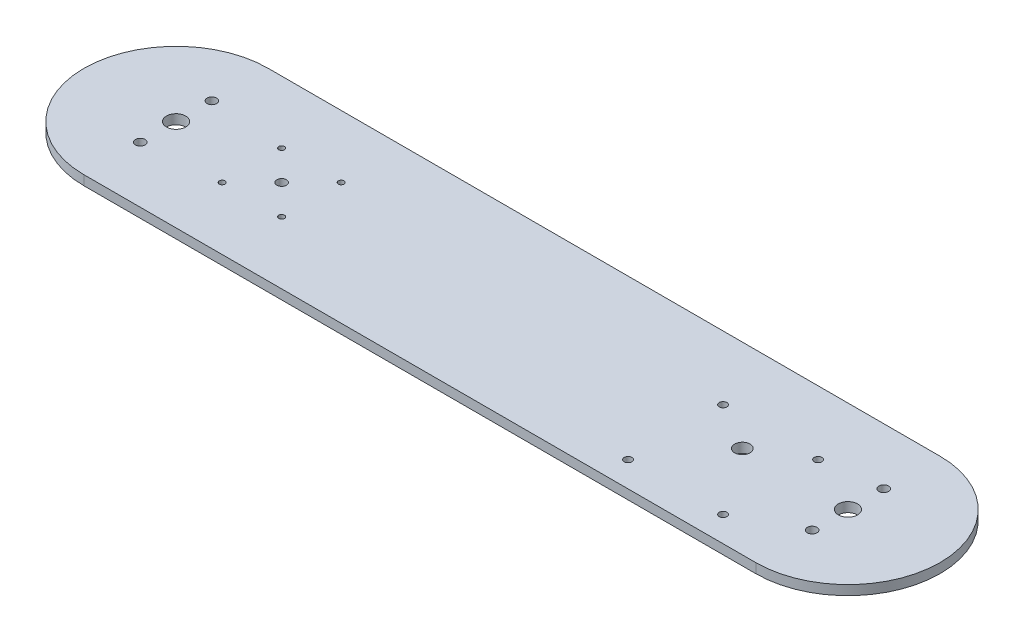
ISO-10303-21;
HEADER;
FILE_DESCRIPTION(('STEP AP214'),'2;1');
FILE_NAME('part.step','',(''),(''),'','','');
FILE_SCHEMA(('AUTOMOTIVE_DESIGN { 1 0 10303 214 1 1 1 1 }'));
ENDSEC;
DATA;
#1=APPLICATION_CONTEXT('core data for automotive mechanical design processes');
#2=APPLICATION_PROTOCOL_DEFINITION('international standard','automotive_design',2000,#1);
#3=PRODUCT_CONTEXT('',#1,'mechanical');
#4=PRODUCT('Part','Part','',(#3));
#5=PRODUCT_RELATED_PRODUCT_CATEGORY('part','',(#4));
#6=PRODUCT_DEFINITION_FORMATION('','',#4);
#7=PRODUCT_DEFINITION_CONTEXT('part definition',#1,'design');
#8=PRODUCT_DEFINITION('design','',#6,#7);
#9=PRODUCT_DEFINITION_SHAPE('','',#8);
#10=(LENGTH_UNIT() NAMED_UNIT(*) SI_UNIT(.MILLI.,.METRE.));
#11=(NAMED_UNIT(*) PLANE_ANGLE_UNIT() SI_UNIT($,.RADIAN.));
#12=(NAMED_UNIT(*) SI_UNIT($,.STERADIAN.) SOLID_ANGLE_UNIT());
#13=UNCERTAINTY_MEASURE_WITH_UNIT(LENGTH_MEASURE(1.E-05),#10,'distance_accuracy_value','');
#14=(GEOMETRIC_REPRESENTATION_CONTEXT(3) GLOBAL_UNCERTAINTY_ASSIGNED_CONTEXT((#13)) GLOBAL_UNIT_ASSIGNED_CONTEXT((#10,
#11,#12)) REPRESENTATION_CONTEXT('',''));
#15=CARTESIAN_POINT('',(0.,0.,0.));
#16=DIRECTION('',(0.,0.,1.));
#17=DIRECTION('',(1.,0.,0.));
#18=AXIS2_PLACEMENT_3D('',#15,#16,#17);
#19=CARTESIAN_POINT('',(-175.,5.,0.));
#20=DIRECTION('',(0.,1.,0.));
#21=DIRECTION('',(0.,0.,1.));
#22=AXIS2_PLACEMENT_3D('',#19,#20,#21);
#23=PLANE('',#22);
#24=CARTESIAN_POINT('',(95.25,5.,-14.7));
#25=DIRECTION('',(0.,1.,0.));
#26=DIRECTION('',(0.,0.,1.));
#27=AXIS2_PLACEMENT_3D('',#24,#25,#26);
#28=CIRCLE('',#27,2.);
#29=CARTESIAN_POINT('',(95.25,5.,-12.7));
#30=VERTEX_POINT('',#29);
#31=EDGE_CURVE('E106',#30,#30,#28,.T.);
#32=ORIENTED_EDGE('',*,*,#31,.F.);
#33=EDGE_LOOP('',(#32));
#34=FACE_BOUND('',#33,.T.);
#35=CARTESIAN_POINT('',(-175.,5.,-18.65));
#36=DIRECTION('',(0.,1.,0.));
#37=DIRECTION('',(0.,0.,1.));
#38=AXIS2_PLACEMENT_3D('',#35,#36,#37);
#39=CIRCLE('',#38,2.50000000000002);
#40=CARTESIAN_POINT('',(-175.,5.,-16.15));
#41=VERTEX_POINT('',#40);
#42=EDGE_CURVE('E144',#41,#41,#39,.F.);
#43=ORIENTED_EDGE('',*,*,#42,.T.);
#44=EDGE_LOOP('',(#43));
#45=FACE_BOUND('',#44,.T.);
#46=CARTESIAN_POINT('',(-175.,5.,0.));
#47=DIRECTION('',(0.,1.,0.));
#48=DIRECTION('',(0.,0.,1.));
#49=AXIS2_PLACEMENT_3D('',#46,#47,#48);
#50=CIRCLE('',#49,48.);
#51=CARTESIAN_POINT('',(-175.,5.,-48.));
#52=VERTEX_POINT('',#51);
#53=CARTESIAN_POINT('',(-175.,5.,48.));
#54=VERTEX_POINT('',#53);
#55=EDGE_CURVE('E91',#52,#54,#50,.T.);
#56=ORIENTED_EDGE('',*,*,#55,.T.);
#57=DIRECTION('',(1.,0.,0.));
#58=VECTOR('',#57,1.);
#59=CARTESIAN_POINT('',(175.,5.,48.));
#60=LINE('',#59,#58);
#61=CARTESIAN_POINT('',(175.,5.,48.));
#62=VERTEX_POINT('',#61);
#63=EDGE_CURVE('E86',#54,#62,#60,.T.);
#64=ORIENTED_EDGE('',*,*,#63,.T.);
#65=CARTESIAN_POINT('',(175.,5.,0.));
#66=DIRECTION('',(0.,1.,0.));
#67=DIRECTION('',(0.,0.,1.));
#68=AXIS2_PLACEMENT_3D('',#65,#66,#67);
#69=CIRCLE('',#68,48.);
#70=CARTESIAN_POINT('',(175.,5.,-48.));
#71=VERTEX_POINT('',#70);
#72=EDGE_CURVE('E89',#62,#71,#69,.T.);
#73=ORIENTED_EDGE('',*,*,#72,.T.);
#74=DIRECTION('',(-1.,0.,0.));
#75=VECTOR('',#74,1.);
#76=CARTESIAN_POINT('',(-175.,5.,-48.));
#77=LINE('',#76,#75);
#78=EDGE_CURVE('E56',#71,#52,#77,.T.);
#79=ORIENTED_EDGE('',*,*,#78,.T.);
#80=EDGE_LOOP('',(#56,#64,#73,#79));
#81=FACE_BOUND('',#80,.T.);
#82=CARTESIAN_POINT('',(175.,5.,18.65));
#83=DIRECTION('',(0.,1.,0.));
#84=DIRECTION('',(0.,0.,1.));
#85=AXIS2_PLACEMENT_3D('',#82,#83,#84);
#86=CIRCLE('',#85,2.50000000000002);
#87=CARTESIAN_POINT('',(175.,5.,21.15));
#88=VERTEX_POINT('',#87);
#89=EDGE_CURVE('E162',#88,#88,#86,.T.);
#90=ORIENTED_EDGE('',*,*,#89,.F.);
#91=EDGE_LOOP('',(#90));
#92=FACE_BOUND('',#91,.T.);
#93=CARTESIAN_POINT('',(175.,5.,-18.65));
#94=DIRECTION('',(0.,1.,0.));
#95=DIRECTION('',(0.,0.,1.));
#96=AXIS2_PLACEMENT_3D('',#93,#94,#95);
#97=CIRCLE('',#96,2.50000000000002);
#98=CARTESIAN_POINT('',(175.,5.,-16.15));
#99=VERTEX_POINT('',#98);
#100=EDGE_CURVE('E159',#99,#99,#97,.T.);
#101=ORIENTED_EDGE('',*,*,#100,.F.);
#102=EDGE_LOOP('',(#101));
#103=FACE_BOUND('',#102,.T.);
#104=CARTESIAN_POINT('',(-120.,5.,0.));
#105=DIRECTION('',(0.,1.,0.));
#106=DIRECTION('',(0.,0.,1.));
#107=AXIS2_PLACEMENT_3D('',#104,#105,#106);
#108=CIRCLE('',#107,2.5);
#109=CARTESIAN_POINT('',(-120.,5.,2.49999999999997));
#110=VERTEX_POINT('',#109);
#111=EDGE_CURVE('E156',#110,#110,#108,.T.);
#112=ORIENTED_EDGE('',*,*,#111,.F.);
#113=EDGE_LOOP('',(#112));
#114=FACE_BOUND('',#113,.T.);
#115=CARTESIAN_POINT('',(-135.5,5.,-15.5));
#116=DIRECTION('',(0.,1.,0.));
#117=DIRECTION('',(0.,0.,1.));
#118=AXIS2_PLACEMENT_3D('',#115,#116,#117);
#119=CIRCLE('',#118,1.5);
#120=CARTESIAN_POINT('',(-135.5,5.,-14.));
#121=VERTEX_POINT('',#120);
#122=EDGE_CURVE('E153',#121,#121,#119,.T.);
#123=ORIENTED_EDGE('',*,*,#122,.F.);
#124=EDGE_LOOP('',(#123));
#125=FACE_BOUND('',#124,.T.);
#126=CARTESIAN_POINT('',(-104.5,5.,15.5));
#127=DIRECTION('',(0.,1.,0.));
#128=DIRECTION('',(0.,0.,1.));
#129=AXIS2_PLACEMENT_3D('',#126,#127,#128);
#130=CIRCLE('',#129,1.5);
#131=CARTESIAN_POINT('',(-104.5,5.,17.));
#132=VERTEX_POINT('',#131);
#133=EDGE_CURVE('E150',#132,#132,#130,.T.);
#134=ORIENTED_EDGE('',*,*,#133,.F.);
#135=EDGE_LOOP('',(#134));
#136=FACE_BOUND('',#135,.T.);
#137=CARTESIAN_POINT('',(-175.,5.,18.65));
#138=DIRECTION('',(0.,1.,0.));
#139=DIRECTION('',(0.,0.,1.));
#140=AXIS2_PLACEMENT_3D('',#137,#138,#139);
#141=CIRCLE('',#140,2.50000000000002);
#142=CARTESIAN_POINT('',(-175.,5.,21.15));
#143=VERTEX_POINT('',#142);
#144=EDGE_CURVE('E147',#143,#143,#141,.F.);
#145=ORIENTED_EDGE('',*,*,#144,.T.);
#146=EDGE_LOOP('',(#145));
#147=FACE_BOUND('',#146,.T.);
#148=CARTESIAN_POINT('',(144.75,5.,34.8));
#149=DIRECTION('',(0.,1.,0.));
#150=DIRECTION('',(0.,0.,1.));
#151=AXIS2_PLACEMENT_3D('',#148,#149,#150);
#152=CIRCLE('',#151,2.);
#153=CARTESIAN_POINT('',(144.75,5.,36.8));
#154=VERTEX_POINT('',#153);
#155=EDGE_CURVE('E141',#154,#154,#152,.T.);
#156=ORIENTED_EDGE('',*,*,#155,.F.);
#157=EDGE_LOOP('',(#156));
#158=FACE_BOUND('',#157,.T.);
#159=CARTESIAN_POINT('',(144.75,5.,-14.7));
#160=DIRECTION('',(0.,1.,0.));
#161=DIRECTION('',(0.,0.,1.));
#162=AXIS2_PLACEMENT_3D('',#159,#160,#161);
#163=CIRCLE('',#162,2.);
#164=CARTESIAN_POINT('',(144.75,5.,-12.7));
#165=VERTEX_POINT('',#164);
#166=EDGE_CURVE('E138',#165,#165,#163,.T.);
#167=ORIENTED_EDGE('',*,*,#166,.F.);
#168=EDGE_LOOP('',(#167));
#169=FACE_BOUND('',#168,.T.);
#170=CARTESIAN_POINT('',(95.25,5.,34.8));
#171=DIRECTION('',(0.,1.,0.));
#172=DIRECTION('',(0.,0.,1.));
#173=AXIS2_PLACEMENT_3D('',#170,#171,#172);
#174=CIRCLE('',#173,2.);
#175=CARTESIAN_POINT('',(95.25,5.,36.8));
#176=VERTEX_POINT('',#175);
#177=EDGE_CURVE('E135',#176,#176,#174,.T.);
#178=ORIENTED_EDGE('',*,*,#177,.F.);
#179=EDGE_LOOP('',(#178));
#180=FACE_BOUND('',#179,.T.);
#181=CARTESIAN_POINT('',(120.,5.,0.));
#182=DIRECTION('',(0.,1.,0.));
#183=DIRECTION('',(0.,0.,1.));
#184=AXIS2_PLACEMENT_3D('',#181,#182,#183);
#185=CIRCLE('',#184,4.00000000000001);
#186=CARTESIAN_POINT('',(120.,5.,4.));
#187=VERTEX_POINT('',#186);
#188=EDGE_CURVE('E132',#187,#187,#185,.T.);
#189=ORIENTED_EDGE('',*,*,#188,.F.);
#190=EDGE_LOOP('',(#189));
#191=FACE_BOUND('',#190,.T.);
#192=CARTESIAN_POINT('',(175.,5.,0.));
#193=DIRECTION('',(0.,1.,0.));
#194=DIRECTION('',(0.,0.,1.));
#195=AXIS2_PLACEMENT_3D('',#192,#193,#194);
#196=CIRCLE('',#195,4.99999999999999);
#197=CARTESIAN_POINT('',(175.,5.,4.99999999999999));
#198=VERTEX_POINT('',#197);
#199=EDGE_CURVE('E129',#198,#198,#196,.T.);
#200=ORIENTED_EDGE('',*,*,#199,.F.);
#201=EDGE_LOOP('',(#200));
#202=FACE_BOUND('',#201,.T.);
#203=CARTESIAN_POINT('',(-135.5,5.,15.5));
#204=DIRECTION('',(0.,1.,0.));
#205=DIRECTION('',(0.,0.,1.));
#206=AXIS2_PLACEMENT_3D('',#203,#204,#205);
#207=CIRCLE('',#206,1.5);
#208=CARTESIAN_POINT('',(-135.5,5.,17.));
#209=VERTEX_POINT('',#208);
#210=EDGE_CURVE('E126',#209,#209,#207,.T.);
#211=ORIENTED_EDGE('',*,*,#210,.F.);
#212=EDGE_LOOP('',(#211));
#213=FACE_BOUND('',#212,.T.);
#214=CARTESIAN_POINT('',(-104.5,5.,-15.5));
#215=DIRECTION('',(0.,1.,0.));
#216=DIRECTION('',(0.,0.,1.));
#217=AXIS2_PLACEMENT_3D('',#214,#215,#216);
#218=CIRCLE('',#217,1.5);
#219=CARTESIAN_POINT('',(-104.5,5.,-14.));
#220=VERTEX_POINT('',#219);
#221=EDGE_CURVE('E123',#220,#220,#218,.T.);
#222=ORIENTED_EDGE('',*,*,#221,.F.);
#223=EDGE_LOOP('',(#222));
#224=FACE_BOUND('',#223,.T.);
#225=CARTESIAN_POINT('',(-175.,5.,0.));
#226=DIRECTION('',(0.,1.,0.));
#227=DIRECTION('',(0.,0.,1.));
#228=AXIS2_PLACEMENT_3D('',#225,#226,#227);
#229=CIRCLE('',#228,4.99999999999999);
#230=CARTESIAN_POINT('',(-175.,5.,4.99999999999999));
#231=VERTEX_POINT('',#230);
#232=EDGE_CURVE('E120',#231,#231,#229,.F.);
#233=ORIENTED_EDGE('',*,*,#232,.T.);
#234=EDGE_LOOP('',(#233));
#235=FACE_BOUND('',#234,.T.);
#236=ADVANCED_FACE('F39',(#34,#45,#81,#92,#103,#114,#125,#136,#147,#158,#169,#180,#191,#202,
#213,#224,#235),#23,.T.);
#237=CARTESIAN_POINT('',(-175.,0.,0.));
#238=DIRECTION('',(0.,1.,0.));
#239=DIRECTION('',(0.,0.,1.));
#240=AXIS2_PLACEMENT_3D('',#237,#238,#239);
#241=PLANE('',#240);
#242=CARTESIAN_POINT('',(95.25,0.,-14.7));
#243=DIRECTION('',(0.,-1.,0.));
#244=DIRECTION('',(0.,0.,-1.));
#245=AXIS2_PLACEMENT_3D('',#242,#243,#244);
#246=CIRCLE('',#245,2.);
#247=CARTESIAN_POINT('',(95.25,0.,-16.7));
#248=VERTEX_POINT('',#247);
#249=EDGE_CURVE('E178',#248,#248,#246,.T.);
#250=ORIENTED_EDGE('',*,*,#249,.F.);
#251=EDGE_LOOP('',(#250));
#252=FACE_BOUND('',#251,.T.);
#253=CARTESIAN_POINT('',(-104.5,0.,-15.5));
#254=DIRECTION('',(0.,-1.,0.));
#255=DIRECTION('',(0.,0.,-1.));
#256=AXIS2_PLACEMENT_3D('',#253,#254,#255);
#257=CIRCLE('',#256,1.5);
#258=CARTESIAN_POINT('',(-104.5,0.,-17.));
#259=VERTEX_POINT('',#258);
#260=EDGE_CURVE('E184',#259,#259,#257,.T.);
#261=ORIENTED_EDGE('',*,*,#260,.F.);
#262=EDGE_LOOP('',(#261));
#263=FACE_BOUND('',#262,.T.);
#264=CARTESIAN_POINT('',(-135.5,0.,15.5));
#265=DIRECTION('',(0.,-1.,0.));
#266=DIRECTION('',(0.,0.,-1.));
#267=AXIS2_PLACEMENT_3D('',#264,#265,#266);
#268=CIRCLE('',#267,1.5);
#269=CARTESIAN_POINT('',(-135.5,0.,14.));
#270=VERTEX_POINT('',#269);
#271=EDGE_CURVE('E187',#270,#270,#268,.T.);
#272=ORIENTED_EDGE('',*,*,#271,.F.);
#273=EDGE_LOOP('',(#272));
#274=FACE_BOUND('',#273,.T.);
#275=CARTESIAN_POINT('',(175.,0.,0.));
#276=DIRECTION('',(0.,-1.,0.));
#277=DIRECTION('',(0.,0.,-1.));
#278=AXIS2_PLACEMENT_3D('',#275,#276,#277);
#279=CIRCLE('',#278,4.99999999999999);
#280=CARTESIAN_POINT('',(175.,0.,-4.99999999999999));
#281=VERTEX_POINT('',#280);
#282=EDGE_CURVE('E168',#281,#281,#279,.T.);
#283=ORIENTED_EDGE('',*,*,#282,.F.);
#284=EDGE_LOOP('',(#283));
#285=FACE_BOUND('',#284,.T.);
#286=CARTESIAN_POINT('',(120.,0.,0.));
#287=DIRECTION('',(0.,-1.,0.));
#288=DIRECTION('',(0.,0.,-1.));
#289=AXIS2_PLACEMENT_3D('',#286,#287,#288);
#290=CIRCLE('',#289,4.00000000000001);
#291=CARTESIAN_POINT('',(120.,0.,-4.00000000000001));
#292=VERTEX_POINT('',#291);
#293=EDGE_CURVE('E169',#292,#292,#290,.T.);
#294=ORIENTED_EDGE('',*,*,#293,.F.);
#295=EDGE_LOOP('',(#294));
#296=FACE_BOUND('',#295,.T.);
#297=CARTESIAN_POINT('',(95.25,0.,34.8));
#298=DIRECTION('',(0.,-1.,0.));
#299=DIRECTION('',(0.,0.,-1.));
#300=AXIS2_PLACEMENT_3D('',#297,#298,#299);
#301=CIRCLE('',#300,2.);
#302=CARTESIAN_POINT('',(95.25,0.,32.8));
#303=VERTEX_POINT('',#302);
#304=EDGE_CURVE('E172',#303,#303,#301,.T.);
#305=ORIENTED_EDGE('',*,*,#304,.F.);
#306=EDGE_LOOP('',(#305));
#307=FACE_BOUND('',#306,.T.);
#308=CARTESIAN_POINT('',(144.75,0.,-14.7));
#309=DIRECTION('',(0.,-1.,0.));
#310=DIRECTION('',(0.,0.,-1.));
#311=AXIS2_PLACEMENT_3D('',#308,#309,#310);
#312=CIRCLE('',#311,2.);
#313=CARTESIAN_POINT('',(144.75,0.,-16.7));
#314=VERTEX_POINT('',#313);
#315=EDGE_CURVE('E175',#314,#314,#312,.T.);
#316=ORIENTED_EDGE('',*,*,#315,.F.);
#317=EDGE_LOOP('',(#316));
#318=FACE_BOUND('',#317,.T.);
#319=CARTESIAN_POINT('',(144.75,0.,34.8));
#320=DIRECTION('',(0.,-1.,0.));
#321=DIRECTION('',(0.,0.,-1.));
#322=AXIS2_PLACEMENT_3D('',#319,#320,#321);
#323=CIRCLE('',#322,2.);
#324=CARTESIAN_POINT('',(144.75,0.,32.8));
#325=VERTEX_POINT('',#324);
#326=EDGE_CURVE('E202',#325,#325,#323,.T.);
#327=ORIENTED_EDGE('',*,*,#326,.F.);
#328=EDGE_LOOP('',(#327));
#329=FACE_BOUND('',#328,.T.);
#330=CARTESIAN_POINT('',(-104.5,0.,15.5));
#331=DIRECTION('',(0.,-1.,0.));
#332=DIRECTION('',(0.,0.,-1.));
#333=AXIS2_PLACEMENT_3D('',#330,#331,#332);
#334=CIRCLE('',#333,1.5);
#335=CARTESIAN_POINT('',(-104.5,0.,14.));
#336=VERTEX_POINT('',#335);
#337=EDGE_CURVE('E190',#336,#336,#334,.T.);
#338=ORIENTED_EDGE('',*,*,#337,.F.);
#339=EDGE_LOOP('',(#338));
#340=FACE_BOUND('',#339,.T.);
#341=CARTESIAN_POINT('',(-135.5,0.,-15.5));
#342=DIRECTION('',(0.,-1.,0.));
#343=DIRECTION('',(0.,0.,-1.));
#344=AXIS2_PLACEMENT_3D('',#341,#342,#343);
#345=CIRCLE('',#344,1.5);
#346=CARTESIAN_POINT('',(-135.5,0.,-17.));
#347=VERTEX_POINT('',#346);
#348=EDGE_CURVE('E193',#347,#347,#345,.T.);
#349=ORIENTED_EDGE('',*,*,#348,.F.);
#350=EDGE_LOOP('',(#349));
#351=FACE_BOUND('',#350,.T.);
#352=CARTESIAN_POINT('',(-120.,0.,0.));
#353=DIRECTION('',(0.,-1.,0.));
#354=DIRECTION('',(0.,0.,-1.));
#355=AXIS2_PLACEMENT_3D('',#352,#353,#354);
#356=CIRCLE('',#355,2.5);
#357=CARTESIAN_POINT('',(-120.,0.,-2.50000000000002));
#358=VERTEX_POINT('',#357);
#359=EDGE_CURVE('E196',#358,#358,#356,.T.);
#360=ORIENTED_EDGE('',*,*,#359,.F.);
#361=EDGE_LOOP('',(#360));
#362=FACE_BOUND('',#361,.T.);
#363=CARTESIAN_POINT('',(175.,0.,-18.65));
#364=DIRECTION('',(0.,-1.,0.));
#365=DIRECTION('',(0.,0.,-1.));
#366=AXIS2_PLACEMENT_3D('',#363,#364,#365);
#367=CIRCLE('',#366,2.50000000000002);
#368=CARTESIAN_POINT('',(175.,0.,-21.15));
#369=VERTEX_POINT('',#368);
#370=EDGE_CURVE('E199',#369,#369,#367,.T.);
#371=ORIENTED_EDGE('',*,*,#370,.F.);
#372=EDGE_LOOP('',(#371));
#373=FACE_BOUND('',#372,.T.);
#374=CARTESIAN_POINT('',(175.,0.,18.65));
#375=DIRECTION('',(0.,-1.,0.));
#376=DIRECTION('',(0.,0.,-1.));
#377=AXIS2_PLACEMENT_3D('',#374,#375,#376);
#378=CIRCLE('',#377,2.50000000000002);
#379=CARTESIAN_POINT('',(175.,0.,16.15));
#380=VERTEX_POINT('',#379);
#381=EDGE_CURVE('E165',#380,#380,#378,.T.);
#382=ORIENTED_EDGE('',*,*,#381,.F.);
#383=EDGE_LOOP('',(#382));
#384=FACE_BOUND('',#383,.T.);
#385=CARTESIAN_POINT('',(-175.,0.,0.));
#386=DIRECTION('',(0.,1.,0.));
#387=DIRECTION('',(0.,0.,1.));
#388=AXIS2_PLACEMENT_3D('',#385,#386,#387);
#389=CIRCLE('',#388,48.);
#390=CARTESIAN_POINT('',(-175.,0.,-48.));
#391=VERTEX_POINT('',#390);
#392=CARTESIAN_POINT('',(-175.,0.,48.));
#393=VERTEX_POINT('',#392);
#394=EDGE_CURVE('E103',#391,#393,#389,.T.);
#395=ORIENTED_EDGE('',*,*,#394,.F.);
#396=DIRECTION('',(-1.,0.,0.));
#397=VECTOR('',#396,1.);
#398=CARTESIAN_POINT('',(-175.,0.,-48.));
#399=LINE('',#398,#397);
#400=CARTESIAN_POINT('',(175.,0.,-48.));
#401=VERTEX_POINT('',#400);
#402=EDGE_CURVE('E79',#401,#391,#399,.T.);
#403=ORIENTED_EDGE('',*,*,#402,.F.);
#404=CARTESIAN_POINT('',(175.,0.,0.));
#405=DIRECTION('',(0.,1.,0.));
#406=DIRECTION('',(0.,0.,1.));
#407=AXIS2_PLACEMENT_3D('',#404,#405,#406);
#408=CIRCLE('',#407,48.);
#409=CARTESIAN_POINT('',(175.,0.,48.));
#410=VERTEX_POINT('',#409);
#411=EDGE_CURVE('E73',#410,#401,#408,.T.);
#412=ORIENTED_EDGE('',*,*,#411,.F.);
#413=DIRECTION('',(1.,0.,0.));
#414=VECTOR('',#413,1.);
#415=CARTESIAN_POINT('',(175.,0.,48.));
#416=LINE('',#415,#414);
#417=EDGE_CURVE('E95',#393,#410,#416,.T.);
#418=ORIENTED_EDGE('',*,*,#417,.F.);
#419=EDGE_LOOP('',(#395,#403,#412,#418));
#420=FACE_BOUND('',#419,.T.);
#421=CARTESIAN_POINT('',(-175.,0.,18.65));
#422=DIRECTION('',(0.,1.,0.));
#423=DIRECTION('',(0.,0.,1.));
#424=AXIS2_PLACEMENT_3D('',#421,#422,#423);
#425=CIRCLE('',#424,2.50000000000002);
#426=CARTESIAN_POINT('',(-175.,0.,21.15));
#427=VERTEX_POINT('',#426);
#428=EDGE_CURVE('E208',#427,#427,#425,.T.);
#429=ORIENTED_EDGE('',*,*,#428,.T.);
#430=EDGE_LOOP('',(#429));
#431=FACE_BOUND('',#430,.T.);
#432=CARTESIAN_POINT('',(-175.,0.,-18.65));
#433=DIRECTION('',(0.,1.,0.));
#434=DIRECTION('',(0.,0.,1.));
#435=AXIS2_PLACEMENT_3D('',#432,#433,#434);
#436=CIRCLE('',#435,2.50000000000002);
#437=CARTESIAN_POINT('',(-175.,0.,-16.15));
#438=VERTEX_POINT('',#437);
#439=EDGE_CURVE('E205',#438,#438,#436,.T.);
#440=ORIENTED_EDGE('',*,*,#439,.T.);
#441=EDGE_LOOP('',(#440));
#442=FACE_BOUND('',#441,.T.);
#443=CARTESIAN_POINT('',(-175.,0.,0.));
#444=DIRECTION('',(0.,-1.,0.));
#445=DIRECTION('',(0.,0.,-1.));
#446=AXIS2_PLACEMENT_3D('',#443,#444,#445);
#447=CIRCLE('',#446,4.99999999999999);
#448=CARTESIAN_POINT('',(-175.,0.,-4.99999999999999));
#449=VERTEX_POINT('',#448);
#450=EDGE_CURVE('E181',#449,#449,#447,.F.);
#451=ORIENTED_EDGE('',*,*,#450,.T.);
#452=EDGE_LOOP('',(#451));
#453=FACE_BOUND('',#452,.T.);
#454=ADVANCED_FACE('F114',(#252,#263,#274,#285,#296,#307,#318,#329,#340,#351,#362,#373,#384,
#420,#431,#442,#453),#241,.F.);
#455=CARTESIAN_POINT('',(-175.,5.,0.));
#456=DIRECTION('',(0.,-1.,0.));
#457=DIRECTION('',(0.,0.,-1.));
#458=AXIS2_PLACEMENT_3D('',#455,#456,#457);
#459=CYLINDRICAL_SURFACE('',#458,48.);
#460=ORIENTED_EDGE('',*,*,#394,.T.);
#461=DIRECTION('',(0.,-1.,0.));
#462=VECTOR('',#461,1.);
#463=CARTESIAN_POINT('',(-175.,5.,48.));
#464=LINE('',#463,#462);
#465=EDGE_CURVE('E11',#54,#393,#464,.T.);
#466=ORIENTED_EDGE('',*,*,#465,.F.);
#467=ORIENTED_EDGE('',*,*,#55,.F.);
#468=DIRECTION('',(0.,-1.,0.));
#469=VECTOR('',#468,1.);
#470=CARTESIAN_POINT('',(-175.,5.,-48.));
#471=LINE('',#470,#469);
#472=EDGE_CURVE('E99',#52,#391,#471,.T.);
#473=ORIENTED_EDGE('',*,*,#472,.T.);
#474=EDGE_LOOP('',(#460,#466,#467,#473));
#475=FACE_BOUND('',#474,.T.);
#476=ADVANCED_FACE('F41',(#475),#459,.T.);
#477=CARTESIAN_POINT('',(175.,5.,48.));
#478=DIRECTION('',(0.,0.,-1.));
#479=DIRECTION('',(-1.,0.,0.));
#480=AXIS2_PLACEMENT_3D('',#477,#478,#479);
#481=PLANE('',#480);
#482=ORIENTED_EDGE('',*,*,#417,.T.);
#483=DIRECTION('',(0.,-1.,0.));
#484=VECTOR('',#483,1.);
#485=CARTESIAN_POINT('',(175.,5.,48.));
#486=LINE('',#485,#484);
#487=EDGE_CURVE('E48',#62,#410,#486,.T.);
#488=ORIENTED_EDGE('',*,*,#487,.F.);
#489=ORIENTED_EDGE('',*,*,#63,.F.);
#490=ORIENTED_EDGE('',*,*,#465,.T.);
#491=EDGE_LOOP('',(#482,#488,#489,#490));
#492=FACE_BOUND('',#491,.T.);
#493=ADVANCED_FACE('F94',(#492),#481,.F.);
#494=CARTESIAN_POINT('',(175.,5.,0.));
#495=DIRECTION('',(0.,-1.,0.));
#496=DIRECTION('',(0.,0.,-1.));
#497=AXIS2_PLACEMENT_3D('',#494,#495,#496);
#498=CYLINDRICAL_SURFACE('',#497,48.);
#499=ORIENTED_EDGE('',*,*,#411,.T.);
#500=DIRECTION('',(0.,-1.,0.));
#501=VECTOR('',#500,1.);
#502=CARTESIAN_POINT('',(175.,5.,-48.));
#503=LINE('',#502,#501);
#504=EDGE_CURVE('E96',#71,#401,#503,.T.);
#505=ORIENTED_EDGE('',*,*,#504,.F.);
#506=ORIENTED_EDGE('',*,*,#72,.F.);
#507=ORIENTED_EDGE('',*,*,#487,.T.);
#508=EDGE_LOOP('',(#499,#505,#506,#507));
#509=FACE_BOUND('',#508,.T.);
#510=ADVANCED_FACE('F97',(#509),#498,.T.);
#511=CARTESIAN_POINT('',(-175.,5.,-48.));
#512=DIRECTION('',(0.,0.,1.));
#513=DIRECTION('',(1.,0.,0.));
#514=AXIS2_PLACEMENT_3D('',#511,#512,#513);
#515=PLANE('',#514);
#516=ORIENTED_EDGE('',*,*,#402,.T.);
#517=ORIENTED_EDGE('',*,*,#472,.F.);
#518=ORIENTED_EDGE('',*,*,#78,.F.);
#519=ORIENTED_EDGE('',*,*,#504,.T.);
#520=EDGE_LOOP('',(#516,#517,#518,#519));
#521=FACE_BOUND('',#520,.T.);
#522=ADVANCED_FACE('F111',(#521),#515,.F.);
#523=CARTESIAN_POINT('',(175.,10.,18.65));
#524=DIRECTION('',(0.,-1.,0.));
#525=DIRECTION('',(0.,0.,-1.));
#526=AXIS2_PLACEMENT_3D('',#523,#524,#525);
#527=CYLINDRICAL_SURFACE('',#526,2.50000000000002);
#528=ORIENTED_EDGE('',*,*,#89,.T.);
#529=EDGE_LOOP('',(#528));
#530=FACE_BOUND('',#529,.T.);
#531=ORIENTED_EDGE('',*,*,#381,.T.);
#532=EDGE_LOOP('',(#531));
#533=FACE_BOUND('',#532,.T.);
#534=ADVANCED_FACE('F244',(#530,#533),#527,.F.);
#535=CARTESIAN_POINT('',(175.,10.,-18.65));
#536=DIRECTION('',(0.,-1.,0.));
#537=DIRECTION('',(0.,0.,-1.));
#538=AXIS2_PLACEMENT_3D('',#535,#536,#537);
#539=CYLINDRICAL_SURFACE('',#538,2.50000000000002);
#540=ORIENTED_EDGE('',*,*,#100,.T.);
#541=EDGE_LOOP('',(#540));
#542=FACE_BOUND('',#541,.T.);
#543=ORIENTED_EDGE('',*,*,#370,.T.);
#544=EDGE_LOOP('',(#543));
#545=FACE_BOUND('',#544,.T.);
#546=ADVANCED_FACE('F282',(#542,#545),#539,.F.);
#547=CARTESIAN_POINT('',(-120.,10.,0.));
#548=DIRECTION('',(0.,-1.,0.));
#549=DIRECTION('',(0.,0.,-1.));
#550=AXIS2_PLACEMENT_3D('',#547,#548,#549);
#551=CYLINDRICAL_SURFACE('',#550,2.5);
#552=ORIENTED_EDGE('',*,*,#111,.T.);
#553=EDGE_LOOP('',(#552));
#554=FACE_BOUND('',#553,.T.);
#555=ORIENTED_EDGE('',*,*,#359,.T.);
#556=EDGE_LOOP('',(#555));
#557=FACE_BOUND('',#556,.T.);
#558=ADVANCED_FACE('F289',(#554,#557),#551,.F.);
#559=CARTESIAN_POINT('',(-135.5,10.,-15.5));
#560=DIRECTION('',(0.,-1.,0.));
#561=DIRECTION('',(0.,0.,-1.));
#562=AXIS2_PLACEMENT_3D('',#559,#560,#561);
#563=CYLINDRICAL_SURFACE('',#562,1.5);
#564=ORIENTED_EDGE('',*,*,#122,.T.);
#565=EDGE_LOOP('',(#564));
#566=FACE_BOUND('',#565,.T.);
#567=ORIENTED_EDGE('',*,*,#348,.T.);
#568=EDGE_LOOP('',(#567));
#569=FACE_BOUND('',#568,.T.);
#570=ADVANCED_FACE('F228',(#566,#569),#563,.F.);
#571=CARTESIAN_POINT('',(-104.5,10.,15.5));
#572=DIRECTION('',(0.,-1.,0.));
#573=DIRECTION('',(0.,0.,-1.));
#574=AXIS2_PLACEMENT_3D('',#571,#572,#573);
#575=CYLINDRICAL_SURFACE('',#574,1.5);
#576=ORIENTED_EDGE('',*,*,#133,.T.);
#577=EDGE_LOOP('',(#576));
#578=FACE_BOUND('',#577,.T.);
#579=ORIENTED_EDGE('',*,*,#337,.T.);
#580=EDGE_LOOP('',(#579));
#581=FACE_BOUND('',#580,.T.);
#582=ADVANCED_FACE('F218',(#578,#581),#575,.F.);
#583=CARTESIAN_POINT('',(-175.,10.,18.65));
#584=DIRECTION('',(0.,-1.,0.));
#585=DIRECTION('',(0.,0.,-1.));
#586=AXIS2_PLACEMENT_3D('',#583,#584,#585);
#587=CYLINDRICAL_SURFACE('',#586,2.50000000000002);
#588=ORIENTED_EDGE('',*,*,#144,.F.);
#589=EDGE_LOOP('',(#588));
#590=FACE_BOUND('',#589,.T.);
#591=ORIENTED_EDGE('',*,*,#428,.F.);
#592=EDGE_LOOP('',(#591));
#593=FACE_BOUND('',#592,.T.);
#594=ADVANCED_FACE('F215',(#590,#593),#587,.F.);
#595=CARTESIAN_POINT('',(-175.,10.,-18.65));
#596=DIRECTION('',(0.,-1.,0.));
#597=DIRECTION('',(0.,0.,-1.));
#598=AXIS2_PLACEMENT_3D('',#595,#596,#597);
#599=CYLINDRICAL_SURFACE('',#598,2.50000000000002);
#600=ORIENTED_EDGE('',*,*,#42,.F.);
#601=EDGE_LOOP('',(#600));
#602=FACE_BOUND('',#601,.T.);
#603=ORIENTED_EDGE('',*,*,#439,.F.);
#604=EDGE_LOOP('',(#603));
#605=FACE_BOUND('',#604,.T.);
#606=ADVANCED_FACE('F217',(#602,#605),#599,.F.);
#607=CARTESIAN_POINT('',(144.75,10.,34.8));
#608=DIRECTION('',(0.,-1.,0.));
#609=DIRECTION('',(0.,0.,-1.));
#610=AXIS2_PLACEMENT_3D('',#607,#608,#609);
#611=CYLINDRICAL_SURFACE('',#610,2.);
#612=ORIENTED_EDGE('',*,*,#155,.T.);
#613=EDGE_LOOP('',(#612));
#614=FACE_BOUND('',#613,.T.);
#615=ORIENTED_EDGE('',*,*,#326,.T.);
#616=EDGE_LOOP('',(#615));
#617=FACE_BOUND('',#616,.T.);
#618=ADVANCED_FACE('F225',(#614,#617),#611,.F.);
#619=CARTESIAN_POINT('',(144.75,10.,-14.7));
#620=DIRECTION('',(0.,-1.,0.));
#621=DIRECTION('',(0.,0.,-1.));
#622=AXIS2_PLACEMENT_3D('',#619,#620,#621);
#623=CYLINDRICAL_SURFACE('',#622,2.);
#624=ORIENTED_EDGE('',*,*,#166,.T.);
#625=EDGE_LOOP('',(#624));
#626=FACE_BOUND('',#625,.T.);
#627=ORIENTED_EDGE('',*,*,#315,.T.);
#628=EDGE_LOOP('',(#627));
#629=FACE_BOUND('',#628,.T.);
#630=ADVANCED_FACE('F331',(#626,#629),#623,.F.);
#631=CARTESIAN_POINT('',(95.25,10.,34.8));
#632=DIRECTION('',(0.,-1.,0.));
#633=DIRECTION('',(0.,0.,-1.));
#634=AXIS2_PLACEMENT_3D('',#631,#632,#633);
#635=CYLINDRICAL_SURFACE('',#634,2.);
#636=ORIENTED_EDGE('',*,*,#177,.T.);
#637=EDGE_LOOP('',(#636));
#638=FACE_BOUND('',#637,.T.);
#639=ORIENTED_EDGE('',*,*,#304,.T.);
#640=EDGE_LOOP('',(#639));
#641=FACE_BOUND('',#640,.T.);
#642=ADVANCED_FACE('F341',(#638,#641),#635,.F.);
#643=CARTESIAN_POINT('',(120.,10.,0.));
#644=DIRECTION('',(0.,-1.,0.));
#645=DIRECTION('',(0.,0.,-1.));
#646=AXIS2_PLACEMENT_3D('',#643,#644,#645);
#647=CYLINDRICAL_SURFACE('',#646,4.00000000000001);
#648=ORIENTED_EDGE('',*,*,#188,.T.);
#649=EDGE_LOOP('',(#648));
#650=FACE_BOUND('',#649,.T.);
#651=ORIENTED_EDGE('',*,*,#293,.T.);
#652=EDGE_LOOP('',(#651));
#653=FACE_BOUND('',#652,.T.);
#654=ADVANCED_FACE('F352',(#650,#653),#647,.F.);
#655=CARTESIAN_POINT('',(175.,10.,0.));
#656=DIRECTION('',(0.,-1.,0.));
#657=DIRECTION('',(0.,0.,-1.));
#658=AXIS2_PLACEMENT_3D('',#655,#656,#657);
#659=CYLINDRICAL_SURFACE('',#658,4.99999999999999);
#660=ORIENTED_EDGE('',*,*,#199,.T.);
#661=EDGE_LOOP('',(#660));
#662=FACE_BOUND('',#661,.T.);
#663=ORIENTED_EDGE('',*,*,#282,.T.);
#664=EDGE_LOOP('',(#663));
#665=FACE_BOUND('',#664,.T.);
#666=ADVANCED_FACE('F363',(#662,#665),#659,.F.);
#667=CARTESIAN_POINT('',(-135.5,10.,15.5));
#668=DIRECTION('',(0.,-1.,0.));
#669=DIRECTION('',(0.,0.,-1.));
#670=AXIS2_PLACEMENT_3D('',#667,#668,#669);
#671=CYLINDRICAL_SURFACE('',#670,1.5);
#672=ORIENTED_EDGE('',*,*,#210,.T.);
#673=EDGE_LOOP('',(#672));
#674=FACE_BOUND('',#673,.T.);
#675=ORIENTED_EDGE('',*,*,#271,.T.);
#676=EDGE_LOOP('',(#675));
#677=FACE_BOUND('',#676,.T.);
#678=ADVANCED_FACE('F373',(#674,#677),#671,.F.);
#679=CARTESIAN_POINT('',(-104.5,10.,-15.5));
#680=DIRECTION('',(0.,-1.,0.));
#681=DIRECTION('',(0.,0.,-1.));
#682=AXIS2_PLACEMENT_3D('',#679,#680,#681);
#683=CYLINDRICAL_SURFACE('',#682,1.5);
#684=ORIENTED_EDGE('',*,*,#221,.T.);
#685=EDGE_LOOP('',(#684));
#686=FACE_BOUND('',#685,.T.);
#687=ORIENTED_EDGE('',*,*,#260,.T.);
#688=EDGE_LOOP('',(#687));
#689=FACE_BOUND('',#688,.T.);
#690=ADVANCED_FACE('F384',(#686,#689),#683,.F.);
#691=CARTESIAN_POINT('',(-175.,10.,0.));
#692=DIRECTION('',(0.,-1.,0.));
#693=DIRECTION('',(0.,0.,-1.));
#694=AXIS2_PLACEMENT_3D('',#691,#692,#693);
#695=CYLINDRICAL_SURFACE('',#694,4.99999999999999);
#696=ORIENTED_EDGE('',*,*,#232,.F.);
#697=EDGE_LOOP('',(#696));
#698=FACE_BOUND('',#697,.T.);
#699=ORIENTED_EDGE('',*,*,#450,.F.);
#700=EDGE_LOOP('',(#699));
#701=FACE_BOUND('',#700,.T.);
#702=ADVANCED_FACE('F395',(#698,#701),#695,.F.);
#703=CARTESIAN_POINT('',(95.25,10.,-14.7));
#704=DIRECTION('',(0.,-1.,0.));
#705=DIRECTION('',(0.,0.,-1.));
#706=AXIS2_PLACEMENT_3D('',#703,#704,#705);
#707=CYLINDRICAL_SURFACE('',#706,2.);
#708=ORIENTED_EDGE('',*,*,#31,.T.);
#709=EDGE_LOOP('',(#708));
#710=FACE_BOUND('',#709,.T.);
#711=ORIENTED_EDGE('',*,*,#249,.T.);
#712=EDGE_LOOP('',(#711));
#713=FACE_BOUND('',#712,.T.);
#714=ADVANCED_FACE('F406',(#710,#713),#707,.F.);
#715=CLOSED_SHELL('',(#236,#454,#476,#493,#510,#522,#534,#546,#558,#570,#582,#594,#606,#618,
#630,#642,#654,#666,#678,#690,#702,#714));
#716=MANIFOLD_SOLID_BREP('B2',#715);
#717=ADVANCED_BREP_SHAPE_REPRESENTATION('',(#18,#716),#14);
#718=SHAPE_DEFINITION_REPRESENTATION(#9,#717);
ENDSEC;
END-ISO-10303-21;
